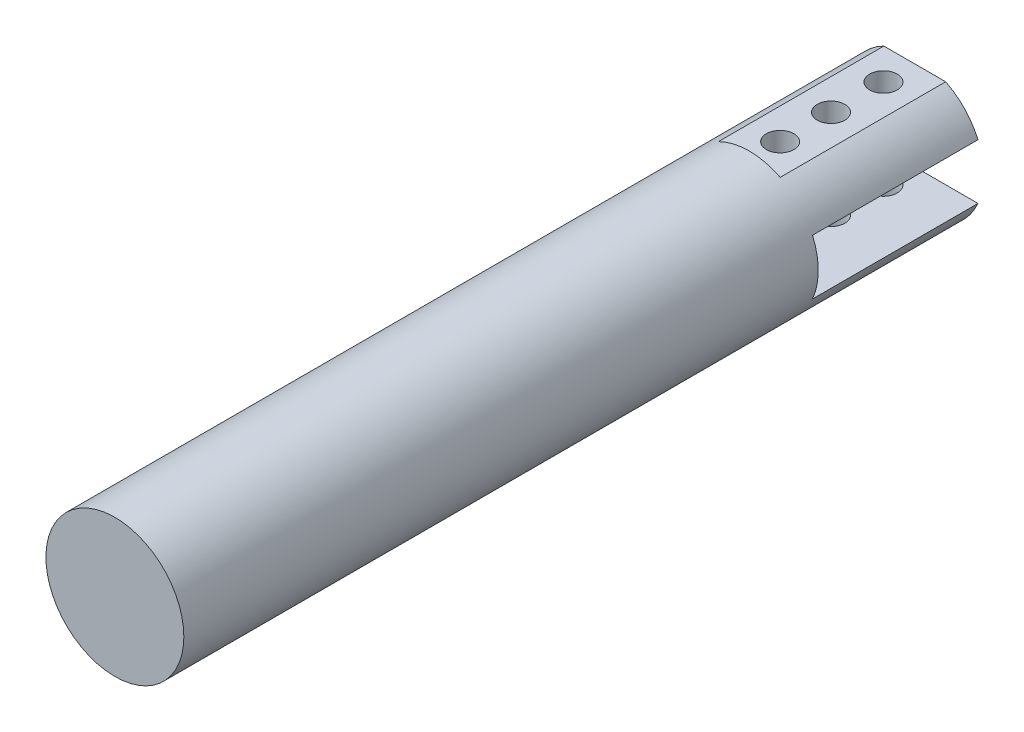
ISO-10303-21;
HEADER;
FILE_DESCRIPTION(('STEP AP214'),'2;1');
FILE_NAME('part.step','',(''),(''),'','','');
FILE_SCHEMA(('AUTOMOTIVE_DESIGN { 1 0 10303 214 1 1 1 1 }'));
ENDSEC;
DATA;
#1=APPLICATION_CONTEXT('core data for automotive mechanical design processes');
#2=APPLICATION_PROTOCOL_DEFINITION('international standard','automotive_design',2000,#1);
#3=PRODUCT_CONTEXT('',#1,'mechanical');
#4=PRODUCT('Part','Part','',(#3));
#5=PRODUCT_RELATED_PRODUCT_CATEGORY('part','',(#4));
#6=PRODUCT_DEFINITION_FORMATION('','',#4);
#7=PRODUCT_DEFINITION_CONTEXT('part definition',#1,'design');
#8=PRODUCT_DEFINITION('design','',#6,#7);
#9=PRODUCT_DEFINITION_SHAPE('','',#8);
#10=(LENGTH_UNIT() NAMED_UNIT(*) SI_UNIT(.MILLI.,.METRE.));
#11=(NAMED_UNIT(*) PLANE_ANGLE_UNIT() SI_UNIT($,.RADIAN.));
#12=(NAMED_UNIT(*) SI_UNIT($,.STERADIAN.) SOLID_ANGLE_UNIT());
#13=UNCERTAINTY_MEASURE_WITH_UNIT(LENGTH_MEASURE(1.E-05),#10,'distance_accuracy_value','');
#14=(GEOMETRIC_REPRESENTATION_CONTEXT(3) GLOBAL_UNCERTAINTY_ASSIGNED_CONTEXT((#13)) GLOBAL_UNIT_ASSIGNED_CONTEXT((#10,
#11,#12)) REPRESENTATION_CONTEXT('',''));
#15=CARTESIAN_POINT('',(0.,0.,0.));
#16=DIRECTION('',(0.,0.,1.));
#17=DIRECTION('',(1.,0.,0.));
#18=AXIS2_PLACEMENT_3D('',#15,#16,#17);
#19=CARTESIAN_POINT('',(0.,0.,0.));
#20=DIRECTION('',(0.,0.,1.));
#21=DIRECTION('',(1.,0.,0.));
#22=AXIS2_PLACEMENT_3D('',#19,#20,#21);
#23=PLANE('',#22);
#24=CARTESIAN_POINT('',(0.,0.,0.));
#25=DIRECTION('',(0.,0.,1.));
#26=DIRECTION('',(1.,0.,0.));
#27=AXIS2_PLACEMENT_3D('',#24,#25,#26);
#28=CIRCLE('',#27,12.5);
#29=CARTESIAN_POINT('',(5.60319328558987,-11.1738187297056,0.));
#30=VERTEX_POINT('',#29);
#31=CARTESIAN_POINT('',(11.4564392373896,-5.,0.));
#32=VERTEX_POINT('',#31);
#33=EDGE_CURVE('E111',#30,#32,#28,.T.);
#34=ORIENTED_EDGE('',*,*,#33,.F.);
#35=DIRECTION('',(1.,0.,0.));
#36=VECTOR('',#35,1.);
#37=CARTESIAN_POINT('',(16.1732901971352,-11.1738187297056,0.));
#38=LINE('',#37,#36);
#39=CARTESIAN_POINT('',(-5.60319328558987,-11.1738187297056,0.));
#40=VERTEX_POINT('',#39);
#41=EDGE_CURVE('E99',#40,#30,#38,.T.);
#42=ORIENTED_EDGE('',*,*,#41,.F.);
#43=CARTESIAN_POINT('',(-11.4564392373896,-5.,0.));
#44=VERTEX_POINT('',#43);
#45=EDGE_CURVE('E110',#44,#40,#28,.T.);
#46=ORIENTED_EDGE('',*,*,#45,.F.);
#47=DIRECTION('',(1.,0.,0.));
#48=VECTOR('',#47,1.);
#49=CARTESIAN_POINT('',(0.,-5.,0.));
#50=LINE('',#49,#48);
#51=EDGE_CURVE('E131',#44,#32,#50,.T.);
#52=ORIENTED_EDGE('',*,*,#51,.T.);
#53=EDGE_LOOP('',(#34,#42,#46,#52));
#54=FACE_BOUND('',#53,.T.);
#55=ADVANCED_FACE('F31',(#54),#23,.F.);
#56=CARTESIAN_POINT('',(0.,0.,145.));
#57=DIRECTION('',(0.,0.,-1.));
#58=DIRECTION('',(-1.,0.,0.));
#59=AXIS2_PLACEMENT_3D('',#56,#57,#58);
#60=CYLINDRICAL_SURFACE('',#59,12.5);
#61=CARTESIAN_POINT('',(0.,0.,30.));
#62=DIRECTION('',(0.,0.,1.));
#63=DIRECTION('',(1.,0.,0.));
#64=AXIS2_PLACEMENT_3D('',#61,#62,#63);
#65=CIRCLE('',#64,12.5);
#66=CARTESIAN_POINT('',(-5.60319328558987,-11.1738187297056,30.));
#67=VERTEX_POINT('',#66);
#68=CARTESIAN_POINT('',(5.60319328558987,-11.1738187297056,30.));
#69=VERTEX_POINT('',#68);
#70=EDGE_CURVE('E11',#67,#69,#65,.T.);
#71=ORIENTED_EDGE('',*,*,#70,.T.);
#72=DIRECTION('',(0.,0.,-1.));
#73=VECTOR('',#72,1.);
#74=CARTESIAN_POINT('',(5.60319328558987,-11.1738187297056,145.));
#75=LINE('',#74,#73);
#76=EDGE_CURVE('E103',#69,#30,#75,.T.);
#77=ORIENTED_EDGE('',*,*,#76,.T.);
#78=ORIENTED_EDGE('',*,*,#33,.T.);
#79=DIRECTION('',(0.,0.,-1.));
#80=VECTOR('',#79,1.);
#81=CARTESIAN_POINT('',(11.4564392373896,-5.,145.));
#82=LINE('',#81,#80);
#83=CARTESIAN_POINT('',(11.4564392373896,-5.,30.));
#84=VERTEX_POINT('',#83);
#85=EDGE_CURVE('E134',#32,#84,#82,.F.);
#86=ORIENTED_EDGE('',*,*,#85,.T.);
#87=CARTESIAN_POINT('',(0.,0.,30.));
#88=DIRECTION('',(0.,0.,-1.));
#89=DIRECTION('',(-1.,0.,0.));
#90=AXIS2_PLACEMENT_3D('',#87,#88,#89);
#91=CIRCLE('',#90,12.5);
#92=CARTESIAN_POINT('',(11.4564392373896,5.,30.));
#93=VERTEX_POINT('',#92);
#94=EDGE_CURVE('E188',#93,#84,#91,.T.);
#95=ORIENTED_EDGE('',*,*,#94,.F.);
#96=DIRECTION('',(0.,0.,-1.));
#97=VECTOR('',#96,1.);
#98=CARTESIAN_POINT('',(11.4564392373896,5.,145.));
#99=LINE('',#98,#97);
#100=CARTESIAN_POINT('',(11.4564392373896,5.,0.));
#101=VERTEX_POINT('',#100);
#102=EDGE_CURVE('E137',#93,#101,#99,.T.);
#103=ORIENTED_EDGE('',*,*,#102,.T.);
#104=CARTESIAN_POINT('',(5.60319328558987,11.1738187297056,0.));
#105=VERTEX_POINT('',#104);
#106=EDGE_CURVE('E119',#101,#105,#28,.T.);
#107=ORIENTED_EDGE('',*,*,#106,.T.);
#108=DIRECTION('',(0.,0.,-1.));
#109=VECTOR('',#108,1.);
#110=CARTESIAN_POINT('',(5.60319328558987,11.1738187297056,145.));
#111=LINE('',#110,#109);
#112=CARTESIAN_POINT('',(5.60319328558987,11.1738187297056,30.));
#113=VERTEX_POINT('',#112);
#114=EDGE_CURVE('E53',#105,#113,#111,.F.);
#115=ORIENTED_EDGE('',*,*,#114,.T.);
#116=CARTESIAN_POINT('',(0.,0.,30.));
#117=DIRECTION('',(0.,0.,-1.));
#118=DIRECTION('',(-1.,0.,0.));
#119=AXIS2_PLACEMENT_3D('',#116,#117,#118);
#120=CIRCLE('',#119,12.5);
#121=CARTESIAN_POINT('',(-5.60319328558987,11.1738187297056,30.));
#122=VERTEX_POINT('',#121);
#123=EDGE_CURVE('E39',#122,#113,#120,.T.);
#124=ORIENTED_EDGE('',*,*,#123,.F.);
#125=DIRECTION('',(0.,0.,-1.));
#126=VECTOR('',#125,1.);
#127=CARTESIAN_POINT('',(-5.60319328558987,11.1738187297056,145.));
#128=LINE('',#127,#126);
#129=CARTESIAN_POINT('',(-5.60319328558987,11.1738187297056,0.));
#130=VERTEX_POINT('',#129);
#131=EDGE_CURVE('E160',#122,#130,#128,.T.);
#132=ORIENTED_EDGE('',*,*,#131,.T.);
#133=CARTESIAN_POINT('',(-11.4564392373896,5.,0.));
#134=VERTEX_POINT('',#133);
#135=EDGE_CURVE('E117',#130,#134,#28,.T.);
#136=ORIENTED_EDGE('',*,*,#135,.T.);
#137=DIRECTION('',(0.,0.,-1.));
#138=VECTOR('',#137,1.);
#139=CARTESIAN_POINT('',(-11.4564392373896,5.,145.));
#140=LINE('',#139,#138);
#141=CARTESIAN_POINT('',(-11.4564392373896,5.,30.));
#142=VERTEX_POINT('',#141);
#143=EDGE_CURVE('E139',#134,#142,#140,.F.);
#144=ORIENTED_EDGE('',*,*,#143,.T.);
#145=CARTESIAN_POINT('',(-11.4564392373896,-5.,30.));
#146=VERTEX_POINT('',#145);
#147=EDGE_CURVE('E197',#146,#142,#91,.T.);
#148=ORIENTED_EDGE('',*,*,#147,.F.);
#149=DIRECTION('',(0.,0.,-1.));
#150=VECTOR('',#149,1.);
#151=CARTESIAN_POINT('',(-11.4564392373896,-5.,145.));
#152=LINE('',#151,#150);
#153=EDGE_CURVE('E116',#146,#44,#152,.T.);
#154=ORIENTED_EDGE('',*,*,#153,.T.);
#155=ORIENTED_EDGE('',*,*,#45,.T.);
#156=DIRECTION('',(0.,0.,-1.));
#157=VECTOR('',#156,1.);
#158=CARTESIAN_POINT('',(-5.60319328558987,-11.1738187297056,145.));
#159=LINE('',#158,#157);
#160=EDGE_CURVE('E96',#40,#67,#159,.F.);
#161=ORIENTED_EDGE('',*,*,#160,.T.);
#162=EDGE_LOOP('',(#71,#77,#78,#86,#95,#103,#107,#115,#124,#132,#136,#144,#148,#154,#155,#161));
#163=FACE_BOUND('',#162,.T.);
#164=CARTESIAN_POINT('',(0.,0.,145.));
#165=DIRECTION('',(0.,0.,1.));
#166=DIRECTION('',(1.,0.,0.));
#167=AXIS2_PLACEMENT_3D('',#164,#165,#166);
#168=CIRCLE('',#167,12.5);
#169=CARTESIAN_POINT('',(12.5,0.,145.));
#170=VERTEX_POINT('',#169);
#171=EDGE_CURVE('E123',#170,#170,#168,.T.);
#172=ORIENTED_EDGE('',*,*,#171,.F.);
#173=EDGE_LOOP('',(#172));
#174=FACE_BOUND('',#173,.T.);
#175=ADVANCED_FACE('F33',(#163,#174),#60,.T.);
#176=CARTESIAN_POINT('',(0.,0.,145.));
#177=DIRECTION('',(0.,0.,1.));
#178=DIRECTION('',(1.,0.,0.));
#179=AXIS2_PLACEMENT_3D('',#176,#177,#178);
#180=PLANE('',#179);
#181=ORIENTED_EDGE('',*,*,#171,.T.);
#182=EDGE_LOOP('',(#181));
#183=FACE_BOUND('',#182,.T.);
#184=ADVANCED_FACE('F222',(#183),#180,.T.);
#185=ORIENTED_EDGE('',*,*,#135,.F.);
#186=DIRECTION('',(-1.,0.,0.));
#187=VECTOR('',#186,1.);
#188=CARTESIAN_POINT('',(16.1732901971352,11.1738187297056,0.));
#189=LINE('',#188,#187);
#190=EDGE_CURVE('E171',#105,#130,#189,.T.);
#191=ORIENTED_EDGE('',*,*,#190,.F.);
#192=ORIENTED_EDGE('',*,*,#106,.F.);
#193=DIRECTION('',(-1.,0.,0.));
#194=VECTOR('',#193,1.);
#195=CARTESIAN_POINT('',(0.,5.,0.));
#196=LINE('',#195,#194);
#197=EDGE_CURVE('E127',#101,#134,#196,.T.);
#198=ORIENTED_EDGE('',*,*,#197,.T.);
#199=EDGE_LOOP('',(#185,#191,#192,#198));
#200=FACE_BOUND('',#199,.T.);
#201=ADVANCED_FACE('F218',(#200),#23,.F.);
#202=CARTESIAN_POINT('',(-35.1004559275796,-5.,30.));
#203=DIRECTION('',(0.,0.,-1.));
#204=DIRECTION('',(-1.,0.,0.));
#205=AXIS2_PLACEMENT_3D('',#202,#203,#204);
#206=PLANE('',#205);
#207=ORIENTED_EDGE('',*,*,#94,.T.);
#208=DIRECTION('',(-1.,0.,0.));
#209=VECTOR('',#208,1.);
#210=CARTESIAN_POINT('',(35.1004559275796,-5.,30.));
#211=LINE('',#210,#209);
#212=EDGE_CURVE('E142',#84,#146,#211,.T.);
#213=ORIENTED_EDGE('',*,*,#212,.T.);
#214=ORIENTED_EDGE('',*,*,#147,.T.);
#215=DIRECTION('',(1.,0.,0.));
#216=VECTOR('',#215,1.);
#217=CARTESIAN_POINT('',(35.1004559275796,5.,30.));
#218=LINE('',#217,#216);
#219=EDGE_CURVE('E145',#142,#93,#218,.T.);
#220=ORIENTED_EDGE('',*,*,#219,.T.);
#221=EDGE_LOOP('',(#207,#213,#214,#220));
#222=FACE_BOUND('',#221,.T.);
#223=ADVANCED_FACE('F225',(#222),#206,.T.);
#224=CARTESIAN_POINT('',(35.1004559275796,-5.,30.));
#225=DIRECTION('',(0.,-1.,0.));
#226=DIRECTION('',(0.,0.,-1.));
#227=AXIS2_PLACEMENT_3D('',#224,#225,#226);
#228=PLANE('',#227);
#229=CARTESIAN_POINT('',(0.,-5.,24.408758255815));
#230=DIRECTION('',(0.,-1.,0.));
#231=DIRECTION('',(0.,0.,-1.));
#232=AXIS2_PLACEMENT_3D('',#229,#230,#231);
#233=CIRCLE('',#232,2.5);
#234=CARTESIAN_POINT('',(0.,-5.,21.908758255815));
#235=VERTEX_POINT('',#234);
#236=EDGE_CURVE('E156',#235,#235,#233,.T.);
#237=ORIENTED_EDGE('',*,*,#236,.T.);
#238=EDGE_LOOP('',(#237));
#239=FACE_BOUND('',#238,.T.);
#240=CARTESIAN_POINT('',(0.,-5.,15.185844733895));
#241=DIRECTION('',(0.,-1.,0.));
#242=DIRECTION('',(0.,0.,-1.));
#243=AXIS2_PLACEMENT_3D('',#240,#241,#242);
#244=CIRCLE('',#243,2.5);
#245=CARTESIAN_POINT('',(0.,-5.,12.685844733895));
#246=VERTEX_POINT('',#245);
#247=EDGE_CURVE('E152',#246,#246,#244,.T.);
#248=ORIENTED_EDGE('',*,*,#247,.T.);
#249=EDGE_LOOP('',(#248));
#250=FACE_BOUND('',#249,.T.);
#251=CARTESIAN_POINT('',(0.,-5.,5.68059709718584));
#252=DIRECTION('',(0.,-1.,0.));
#253=DIRECTION('',(0.,0.,-1.));
#254=AXIS2_PLACEMENT_3D('',#251,#252,#253);
#255=CIRCLE('',#254,2.5);
#256=CARTESIAN_POINT('',(0.,-5.,3.18059709718584));
#257=VERTEX_POINT('',#256);
#258=EDGE_CURVE('E148',#257,#257,#255,.T.);
#259=ORIENTED_EDGE('',*,*,#258,.T.);
#260=EDGE_LOOP('',(#259));
#261=FACE_BOUND('',#260,.T.);
#262=ORIENTED_EDGE('',*,*,#212,.F.);
#263=ORIENTED_EDGE('',*,*,#85,.F.);
#264=ORIENTED_EDGE('',*,*,#51,.F.);
#265=ORIENTED_EDGE('',*,*,#153,.F.);
#266=EDGE_LOOP('',(#262,#263,#264,#265));
#267=FACE_BOUND('',#266,.T.);
#268=ADVANCED_FACE('F202',(#239,#250,#261,#267),#228,.F.);
#269=CARTESIAN_POINT('',(35.1004559275796,5.,30.));
#270=DIRECTION('',(0.,1.,0.));
#271=DIRECTION('',(0.,0.,1.));
#272=AXIS2_PLACEMENT_3D('',#269,#270,#271);
#273=PLANE('',#272);
#274=CARTESIAN_POINT('',(0.,5.,24.408758255815));
#275=DIRECTION('',(0.,1.,0.));
#276=DIRECTION('',(0.,0.,1.));
#277=AXIS2_PLACEMENT_3D('',#274,#275,#276);
#278=CIRCLE('',#277,2.5);
#279=CARTESIAN_POINT('',(0.,5.,26.908758255815));
#280=VERTEX_POINT('',#279);
#281=EDGE_CURVE('E159',#280,#280,#278,.T.);
#282=ORIENTED_EDGE('',*,*,#281,.T.);
#283=EDGE_LOOP('',(#282));
#284=FACE_BOUND('',#283,.T.);
#285=CARTESIAN_POINT('',(0.,5.,15.185844733895));
#286=DIRECTION('',(0.,1.,0.));
#287=DIRECTION('',(0.,0.,1.));
#288=AXIS2_PLACEMENT_3D('',#285,#286,#287);
#289=CIRCLE('',#288,2.5);
#290=CARTESIAN_POINT('',(0.,5.,17.685844733895));
#291=VERTEX_POINT('',#290);
#292=EDGE_CURVE('E155',#291,#291,#289,.T.);
#293=ORIENTED_EDGE('',*,*,#292,.T.);
#294=EDGE_LOOP('',(#293));
#295=FACE_BOUND('',#294,.T.);
#296=CARTESIAN_POINT('',(0.,5.,5.68059709718584));
#297=DIRECTION('',(0.,1.,0.));
#298=DIRECTION('',(0.,0.,1.));
#299=AXIS2_PLACEMENT_3D('',#296,#297,#298);
#300=CIRCLE('',#299,2.5);
#301=CARTESIAN_POINT('',(0.,5.,8.18059709718585));
#302=VERTEX_POINT('',#301);
#303=EDGE_CURVE('E151',#302,#302,#300,.T.);
#304=ORIENTED_EDGE('',*,*,#303,.T.);
#305=EDGE_LOOP('',(#304));
#306=FACE_BOUND('',#305,.T.);
#307=ORIENTED_EDGE('',*,*,#219,.F.);
#308=ORIENTED_EDGE('',*,*,#143,.F.);
#309=ORIENTED_EDGE('',*,*,#197,.F.);
#310=ORIENTED_EDGE('',*,*,#102,.F.);
#311=EDGE_LOOP('',(#307,#308,#309,#310));
#312=FACE_BOUND('',#311,.T.);
#313=ADVANCED_FACE('F238',(#284,#295,#306,#312),#273,.F.);
#314=CARTESIAN_POINT('',(0.,-35.,5.68059709718584));
#315=DIRECTION('',(0.,1.,0.));
#316=DIRECTION('',(0.,0.,1.));
#317=AXIS2_PLACEMENT_3D('',#314,#315,#316);
#318=CYLINDRICAL_SURFACE('',#317,2.5);
#319=CARTESIAN_POINT('',(0.,11.1738187297056,5.68059709718584));
#320=DIRECTION('',(0.,-1.,0.));
#321=DIRECTION('',(0.,0.,-1.));
#322=AXIS2_PLACEMENT_3D('',#319,#320,#321);
#323=CIRCLE('',#322,2.5);
#324=CARTESIAN_POINT('',(0.,11.1738187297056,3.18059709718584));
#325=VERTEX_POINT('',#324);
#326=EDGE_CURVE('E164',#325,#325,#323,.F.);
#327=ORIENTED_EDGE('',*,*,#326,.T.);
#328=EDGE_LOOP('',(#327));
#329=FACE_BOUND('',#328,.T.);
#330=ORIENTED_EDGE('',*,*,#303,.F.);
#331=EDGE_LOOP('',(#330));
#332=FACE_BOUND('',#331,.T.);
#333=ADVANCED_FACE('F240',(#329,#332),#318,.F.);
#334=CARTESIAN_POINT('',(0.,-11.1738187297056,5.68059709718584));
#335=DIRECTION('',(0.,1.,0.));
#336=DIRECTION('',(0.,0.,1.));
#337=AXIS2_PLACEMENT_3D('',#334,#335,#336);
#338=CIRCLE('',#337,2.5);
#339=CARTESIAN_POINT('',(0.,-11.1738187297056,8.18059709718585));
#340=VERTEX_POINT('',#339);
#341=EDGE_CURVE('E104',#340,#340,#338,.F.);
#342=ORIENTED_EDGE('',*,*,#341,.T.);
#343=EDGE_LOOP('',(#342));
#344=FACE_BOUND('',#343,.T.);
#345=ORIENTED_EDGE('',*,*,#258,.F.);
#346=EDGE_LOOP('',(#345));
#347=FACE_BOUND('',#346,.T.);
#348=ADVANCED_FACE('F247',(#344,#347),#318,.F.);
#349=CARTESIAN_POINT('',(0.,-35.,15.185844733895));
#350=DIRECTION('',(0.,1.,0.));
#351=DIRECTION('',(0.,0.,1.));
#352=AXIS2_PLACEMENT_3D('',#349,#350,#351);
#353=CYLINDRICAL_SURFACE('',#352,2.5);
#354=CARTESIAN_POINT('',(0.,11.1738187297056,15.185844733895));
#355=DIRECTION('',(0.,-1.,0.));
#356=DIRECTION('',(0.,0.,-1.));
#357=AXIS2_PLACEMENT_3D('',#354,#355,#356);
#358=CIRCLE('',#357,2.5);
#359=CARTESIAN_POINT('',(0.,11.1738187297056,12.685844733895));
#360=VERTEX_POINT('',#359);
#361=EDGE_CURVE('E167',#360,#360,#358,.F.);
#362=ORIENTED_EDGE('',*,*,#361,.T.);
#363=EDGE_LOOP('',(#362));
#364=FACE_BOUND('',#363,.T.);
#365=ORIENTED_EDGE('',*,*,#292,.F.);
#366=EDGE_LOOP('',(#365));
#367=FACE_BOUND('',#366,.T.);
#368=ADVANCED_FACE('F255',(#364,#367),#353,.F.);
#369=CARTESIAN_POINT('',(0.,-11.1738187297056,15.185844733895));
#370=DIRECTION('',(0.,1.,0.));
#371=DIRECTION('',(0.,0.,1.));
#372=AXIS2_PLACEMENT_3D('',#369,#370,#371);
#373=CIRCLE('',#372,2.5);
#374=CARTESIAN_POINT('',(0.,-11.1738187297056,17.685844733895));
#375=VERTEX_POINT('',#374);
#376=EDGE_CURVE('E179',#375,#375,#373,.F.);
#377=ORIENTED_EDGE('',*,*,#376,.T.);
#378=EDGE_LOOP('',(#377));
#379=FACE_BOUND('',#378,.T.);
#380=ORIENTED_EDGE('',*,*,#247,.F.);
#381=EDGE_LOOP('',(#380));
#382=FACE_BOUND('',#381,.T.);
#383=ADVANCED_FACE('F257',(#379,#382),#353,.F.);
#384=CARTESIAN_POINT('',(0.,-35.,24.408758255815));
#385=DIRECTION('',(0.,1.,0.));
#386=DIRECTION('',(0.,0.,1.));
#387=AXIS2_PLACEMENT_3D('',#384,#385,#386);
#388=CYLINDRICAL_SURFACE('',#387,2.5);
#389=CARTESIAN_POINT('',(0.,11.1738187297056,24.408758255815));
#390=DIRECTION('',(0.,-1.,0.));
#391=DIRECTION('',(0.,0.,-1.));
#392=AXIS2_PLACEMENT_3D('',#389,#390,#391);
#393=CIRCLE('',#392,2.5);
#394=CARTESIAN_POINT('',(0.,11.1738187297056,21.908758255815));
#395=VERTEX_POINT('',#394);
#396=EDGE_CURVE('E170',#395,#395,#393,.F.);
#397=ORIENTED_EDGE('',*,*,#396,.T.);
#398=EDGE_LOOP('',(#397));
#399=FACE_BOUND('',#398,.T.);
#400=ORIENTED_EDGE('',*,*,#281,.F.);
#401=EDGE_LOOP('',(#400));
#402=FACE_BOUND('',#401,.T.);
#403=ADVANCED_FACE('F260',(#399,#402),#388,.F.);
#404=CARTESIAN_POINT('',(0.,-11.1738187297056,24.408758255815));
#405=DIRECTION('',(0.,1.,0.));
#406=DIRECTION('',(0.,0.,1.));
#407=AXIS2_PLACEMENT_3D('',#404,#405,#406);
#408=CIRCLE('',#407,2.5);
#409=CARTESIAN_POINT('',(0.,-11.1738187297056,26.908758255815));
#410=VERTEX_POINT('',#409);
#411=EDGE_CURVE('E181',#410,#410,#408,.F.);
#412=ORIENTED_EDGE('',*,*,#411,.T.);
#413=EDGE_LOOP('',(#412));
#414=FACE_BOUND('',#413,.T.);
#415=ORIENTED_EDGE('',*,*,#236,.F.);
#416=EDGE_LOOP('',(#415));
#417=FACE_BOUND('',#416,.T.);
#418=ADVANCED_FACE('F262',(#414,#417),#388,.F.);
#419=CARTESIAN_POINT('',(16.1732901971352,11.1738187297056,30.));
#420=DIRECTION('',(0.,0.,-1.));
#421=DIRECTION('',(-1.,0.,0.));
#422=AXIS2_PLACEMENT_3D('',#419,#420,#421);
#423=PLANE('',#422);
#424=ORIENTED_EDGE('',*,*,#123,.T.);
#425=DIRECTION('',(-1.,0.,0.));
#426=VECTOR('',#425,1.);
#427=CARTESIAN_POINT('',(16.1732901971352,11.1738187297056,30.));
#428=LINE('',#427,#426);
#429=EDGE_CURVE('E173',#113,#122,#428,.T.);
#430=ORIENTED_EDGE('',*,*,#429,.T.);
#431=EDGE_LOOP('',(#424,#430));
#432=FACE_BOUND('',#431,.T.);
#433=ADVANCED_FACE('F214',(#432),#423,.T.);
#434=CARTESIAN_POINT('',(16.1732901971352,11.1738187297056,30.));
#435=DIRECTION('',(0.,-1.,0.));
#436=DIRECTION('',(0.,0.,-1.));
#437=AXIS2_PLACEMENT_3D('',#434,#435,#436);
#438=PLANE('',#437);
#439=ORIENTED_EDGE('',*,*,#361,.F.);
#440=EDGE_LOOP('',(#439));
#441=FACE_BOUND('',#440,.T.);
#442=ORIENTED_EDGE('',*,*,#396,.F.);
#443=EDGE_LOOP('',(#442));
#444=FACE_BOUND('',#443,.T.);
#445=ORIENTED_EDGE('',*,*,#326,.F.);
#446=EDGE_LOOP('',(#445));
#447=FACE_BOUND('',#446,.T.);
#448=ORIENTED_EDGE('',*,*,#429,.F.);
#449=ORIENTED_EDGE('',*,*,#114,.F.);
#450=ORIENTED_EDGE('',*,*,#190,.T.);
#451=ORIENTED_EDGE('',*,*,#131,.F.);
#452=EDGE_LOOP('',(#448,#449,#450,#451));
#453=FACE_BOUND('',#452,.T.);
#454=ADVANCED_FACE('F206',(#441,#444,#447,#453),#438,.F.);
#455=CARTESIAN_POINT('',(16.1732901971352,-11.1738187297056,30.));
#456=DIRECTION('',(0.,0.,1.));
#457=DIRECTION('',(1.,0.,0.));
#458=AXIS2_PLACEMENT_3D('',#455,#456,#457);
#459=PLANE('',#458);
#460=DIRECTION('',(1.,0.,0.));
#461=VECTOR('',#460,1.);
#462=CARTESIAN_POINT('',(16.1732901971352,-11.1738187297056,30.));
#463=LINE('',#462,#461);
#464=EDGE_CURVE('E45',#67,#69,#463,.T.);
#465=ORIENTED_EDGE('',*,*,#464,.T.);
#466=ORIENTED_EDGE('',*,*,#70,.F.);
#467=EDGE_LOOP('',(#465,#466));
#468=FACE_BOUND('',#467,.T.);
#469=ADVANCED_FACE('F204',(#468),#459,.F.);
#470=CARTESIAN_POINT('',(16.1732901971352,-11.1738187297056,30.));
#471=DIRECTION('',(0.,1.,0.));
#472=DIRECTION('',(0.,0.,1.));
#473=AXIS2_PLACEMENT_3D('',#470,#471,#472);
#474=PLANE('',#473);
#475=ORIENTED_EDGE('',*,*,#376,.F.);
#476=EDGE_LOOP('',(#475));
#477=FACE_BOUND('',#476,.T.);
#478=ORIENTED_EDGE('',*,*,#411,.F.);
#479=EDGE_LOOP('',(#478));
#480=FACE_BOUND('',#479,.T.);
#481=ORIENTED_EDGE('',*,*,#341,.F.);
#482=EDGE_LOOP('',(#481));
#483=FACE_BOUND('',#482,.T.);
#484=ORIENTED_EDGE('',*,*,#464,.F.);
#485=ORIENTED_EDGE('',*,*,#160,.F.);
#486=ORIENTED_EDGE('',*,*,#41,.T.);
#487=ORIENTED_EDGE('',*,*,#76,.F.);
#488=EDGE_LOOP('',(#484,#485,#486,#487));
#489=FACE_BOUND('',#488,.T.);
#490=ADVANCED_FACE('F98',(#477,#480,#483,#489),#474,.F.);
#491=CLOSED_SHELL('',(#55,#175,#184,#201,#223,#268,#313,#333,#348,#368,#383,#403,#418,#433,#454,
#469,#490));
#492=MANIFOLD_SOLID_BREP('B2',#491);
#493=ADVANCED_BREP_SHAPE_REPRESENTATION('',(#18,#492),#14);
#494=SHAPE_DEFINITION_REPRESENTATION(#9,#493);
ENDSEC;
END-ISO-10303-21;
